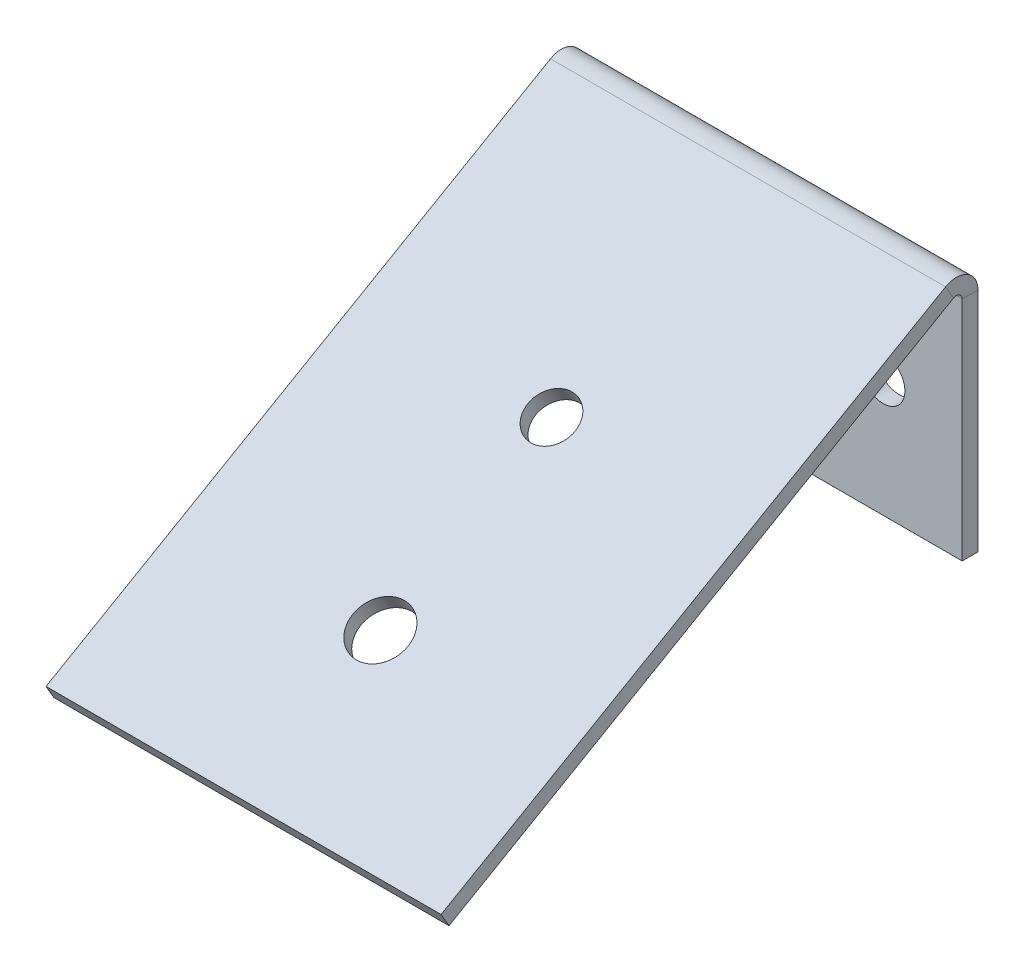
ISO-10303-21;
HEADER;
FILE_DESCRIPTION(('STEP AP214'),'2;1');
FILE_NAME('part.step','',(''),(''),'','','');
FILE_SCHEMA(('AUTOMOTIVE_DESIGN { 1 0 10303 214 1 1 1 1 }'));
ENDSEC;
DATA;
#1=APPLICATION_CONTEXT('core data for automotive mechanical design processes');
#2=APPLICATION_PROTOCOL_DEFINITION('international standard','automotive_design',2000,#1);
#3=PRODUCT_CONTEXT('',#1,'mechanical');
#4=PRODUCT('Part','Part','',(#3));
#5=PRODUCT_RELATED_PRODUCT_CATEGORY('part','',(#4));
#6=PRODUCT_DEFINITION_FORMATION('','',#4);
#7=PRODUCT_DEFINITION_CONTEXT('part definition',#1,'design');
#8=PRODUCT_DEFINITION('design','',#6,#7);
#9=PRODUCT_DEFINITION_SHAPE('','',#8);
#10=(LENGTH_UNIT() NAMED_UNIT(*) SI_UNIT(.MILLI.,.METRE.));
#11=(NAMED_UNIT(*) PLANE_ANGLE_UNIT() SI_UNIT($,.RADIAN.));
#12=(NAMED_UNIT(*) SI_UNIT($,.STERADIAN.) SOLID_ANGLE_UNIT());
#13=UNCERTAINTY_MEASURE_WITH_UNIT(LENGTH_MEASURE(1.E-05),#10,'distance_accuracy_value','');
#14=(GEOMETRIC_REPRESENTATION_CONTEXT(3) GLOBAL_UNCERTAINTY_ASSIGNED_CONTEXT((#13)) GLOBAL_UNIT_ASSIGNED_CONTEXT((#10,
#11,#12)) REPRESENTATION_CONTEXT('',''));
#15=CARTESIAN_POINT('',(0.,0.,0.));
#16=DIRECTION('',(0.,0.,1.));
#17=DIRECTION('',(1.,0.,0.));
#18=AXIS2_PLACEMENT_3D('',#15,#16,#17);
#19=CARTESIAN_POINT('',(50.,29.3620856875724,1.10490000000001));
#20=DIRECTION('',(1.,0.,0.));
#21=DIRECTION('',(0.,0.,-1.));
#22=AXIS2_PLACEMENT_3D('',#19,#20,#21);
#23=PLANE('',#22);
#24=DIRECTION('',(0.,0.866025403784435,0.500000000000006));
#25=VECTOR('',#24,1.);
#26=CARTESIAN_POINT('',(50.,29.3620856875724,1.10490000000001));
#27=LINE('',#26,#25);
#28=CARTESIAN_POINT('',(50.,29.3620856875724,1.10490000000001));
#29=VERTEX_POINT('',#28);
#30=CARTESIAN_POINT('',(50.,31.0941364951412,2.10490000000002));
#31=VERTEX_POINT('',#30);
#32=EDGE_CURVE('E11',#29,#31,#27,.T.);
#33=ORIENTED_EDGE('',*,*,#32,.F.);
#34=CARTESIAN_POINT('',(50.,28.7241713751448,0.736600000000001));
#35=DIRECTION('',(-1.,0.,0.));
#36=DIRECTION('',(0.,0.,1.));
#37=AXIS2_PLACEMENT_3D('',#34,#35,#36);
#38=CIRCLE('',#37,0.7366);
#39=CARTESIAN_POINT('',(50.,28.7241713751448,0.));
#40=VERTEX_POINT('',#39);
#41=EDGE_CURVE('E128',#29,#40,#38,.T.);
#42=ORIENTED_EDGE('',*,*,#41,.T.);
#43=DIRECTION('',(0.,0.,1.));
#44=VECTOR('',#43,1.);
#45=CARTESIAN_POINT('',(50.,28.7241713751448,-2.));
#46=LINE('',#45,#44);
#47=CARTESIAN_POINT('',(50.,28.7241713751448,-2.));
#48=VERTEX_POINT('',#47);
#49=EDGE_CURVE('E46',#48,#40,#46,.T.);
#50=ORIENTED_EDGE('',*,*,#49,.F.);
#51=CARTESIAN_POINT('',(50.,28.7241713751448,0.736600000000001));
#52=DIRECTION('',(1.,0.,0.));
#53=DIRECTION('',(0.,0.,-1.));
#54=AXIS2_PLACEMENT_3D('',#51,#52,#53);
#55=CIRCLE('',#54,2.7366);
#56=EDGE_CURVE('E135',#31,#48,#55,.F.);
#57=ORIENTED_EDGE('',*,*,#56,.F.);
#58=EDGE_LOOP('',(#33,#42,#50,#57));
#59=FACE_BOUND('',#58,.T.);
#60=ADVANCED_FACE('F38',(#59),#23,.T.);
#61=CARTESIAN_POINT('',(50.,28.7241713751448,-2.));
#62=DIRECTION('',(1.,0.,0.));
#63=DIRECTION('',(0.,0.,-1.));
#64=AXIS2_PLACEMENT_3D('',#61,#62,#63);
#65=PLANE('',#64);
#66=DIRECTION('',(0.,0.500000000000004,-0.866025403784436));
#67=VECTOR('',#66,1.);
#68=CARTESIAN_POINT('',(50.,30.,0.));
#69=LINE('',#68,#67);
#70=CARTESIAN_POINT('',(50.,-7.50000000000032,64.9519052838327));
#71=VERTEX_POINT('',#70);
#72=EDGE_CURVE('E123',#71,#29,#69,.T.);
#73=ORIENTED_EDGE('',*,*,#72,.T.);
#74=ORIENTED_EDGE('',*,*,#32,.T.);
#75=DIRECTION('',(0.,0.500000000000004,-0.866025403784436));
#76=VECTOR('',#75,1.);
#77=CARTESIAN_POINT('',(50.,31.7320508075689,1.00000000000001));
#78=LINE('',#77,#76);
#79=CARTESIAN_POINT('',(50.,-5.76794919243146,65.9519052838328));
#80=VERTEX_POINT('',#79);
#81=EDGE_CURVE('E133',#80,#31,#78,.T.);
#82=ORIENTED_EDGE('',*,*,#81,.F.);
#83=DIRECTION('',(0.,0.866025403784427,0.50000000000002));
#84=VECTOR('',#83,1.);
#85=CARTESIAN_POINT('',(50.,-7.50000000000032,64.9519052838327));
#86=LINE('',#85,#84);
#87=EDGE_CURVE('E114',#71,#80,#86,.T.);
#88=ORIENTED_EDGE('',*,*,#87,.F.);
#89=EDGE_LOOP('',(#73,#74,#82,#88));
#90=FACE_BOUND('',#89,.T.);
#91=ADVANCED_FACE('F131',(#90),#65,.T.);
#92=CARTESIAN_POINT('',(0.,28.7241713751448,0.));
#93=DIRECTION('',(-1.,0.,0.));
#94=DIRECTION('',(0.,0.,1.));
#95=AXIS2_PLACEMENT_3D('',#92,#93,#94);
#96=PLANE('',#95);
#97=DIRECTION('',(0.,0.,-1.));
#98=VECTOR('',#97,1.);
#99=CARTESIAN_POINT('',(0.,28.7241713751448,0.));
#100=LINE('',#99,#98);
#101=CARTESIAN_POINT('',(0.,28.7241713751448,0.));
#102=VERTEX_POINT('',#101);
#103=CARTESIAN_POINT('',(0.,28.7241713751448,-2.));
#104=VERTEX_POINT('',#103);
#105=EDGE_CURVE('E89',#102,#104,#100,.T.);
#106=ORIENTED_EDGE('',*,*,#105,.F.);
#107=CARTESIAN_POINT('',(0.,28.7241713751448,0.736600000000001));
#108=DIRECTION('',(-1.,0.,0.));
#109=DIRECTION('',(0.,0.,1.));
#110=AXIS2_PLACEMENT_3D('',#107,#108,#109);
#111=CIRCLE('',#110,0.7366);
#112=CARTESIAN_POINT('',(0.,29.3620856875724,1.10490000000001));
#113=VERTEX_POINT('',#112);
#114=EDGE_CURVE('E158',#113,#102,#111,.T.);
#115=ORIENTED_EDGE('',*,*,#114,.F.);
#116=DIRECTION('',(0.,-0.866025403784435,-0.500000000000006));
#117=VECTOR('',#116,1.);
#118=CARTESIAN_POINT('',(0.,31.0941364951412,2.10490000000002));
#119=LINE('',#118,#117);
#120=CARTESIAN_POINT('',(0.,31.0941364951412,2.10490000000002));
#121=VERTEX_POINT('',#120);
#122=EDGE_CURVE('E82',#121,#113,#119,.T.);
#123=ORIENTED_EDGE('',*,*,#122,.F.);
#124=CARTESIAN_POINT('',(0.,28.7241713751448,0.736600000000001));
#125=DIRECTION('',(1.,0.,0.));
#126=DIRECTION('',(0.,0.,-1.));
#127=AXIS2_PLACEMENT_3D('',#124,#125,#126);
#128=CIRCLE('',#127,2.7366);
#129=EDGE_CURVE('E151',#121,#104,#128,.F.);
#130=ORIENTED_EDGE('',*,*,#129,.T.);
#131=EDGE_LOOP('',(#106,#115,#123,#130));
#132=FACE_BOUND('',#131,.T.);
#133=ADVANCED_FACE('F190',(#132),#96,.T.);
#134=CARTESIAN_POINT('',(0.,31.0941364951412,2.10490000000002));
#135=DIRECTION('',(-1.,0.,0.));
#136=DIRECTION('',(0.,0.,1.));
#137=AXIS2_PLACEMENT_3D('',#134,#135,#136);
#138=PLANE('',#137);
#139=DIRECTION('',(0.,-1.,0.));
#140=VECTOR('',#139,1.);
#141=CARTESIAN_POINT('',(0.,0.,0.));
#142=LINE('',#141,#140);
#143=CARTESIAN_POINT('',(0.,0.,0.));
#144=VERTEX_POINT('',#143);
#145=EDGE_CURVE('E141',#102,#144,#142,.T.);
#146=ORIENTED_EDGE('',*,*,#145,.F.);
#147=ORIENTED_EDGE('',*,*,#105,.T.);
#148=DIRECTION('',(0.,1.,0.));
#149=VECTOR('',#148,1.);
#150=CARTESIAN_POINT('',(0.,0.,-2.));
#151=LINE('',#150,#149);
#152=CARTESIAN_POINT('',(0.,0.,-2.));
#153=VERTEX_POINT('',#152);
#154=EDGE_CURVE('E148',#104,#153,#151,.F.);
#155=ORIENTED_EDGE('',*,*,#154,.T.);
#156=DIRECTION('',(0.,0.,1.));
#157=VECTOR('',#156,1.);
#158=CARTESIAN_POINT('',(0.,0.,-2.));
#159=LINE('',#158,#157);
#160=EDGE_CURVE('E144',#153,#144,#159,.T.);
#161=ORIENTED_EDGE('',*,*,#160,.T.);
#162=EDGE_LOOP('',(#146,#147,#155,#161));
#163=FACE_BOUND('',#162,.T.);
#164=ADVANCED_FACE('F177',(#163),#138,.T.);
#165=CARTESIAN_POINT('',(50.,0.,0.));
#166=DIRECTION('',(0.,0.,-1.));
#167=DIRECTION('',(-1.,0.,0.));
#168=AXIS2_PLACEMENT_3D('',#165,#166,#167);
#169=PLANE('',#168);
#170=CARTESIAN_POINT('',(10.,15.,0.));
#171=DIRECTION('',(0.,0.,-1.));
#172=DIRECTION('',(-1.,0.,0.));
#173=AXIS2_PLACEMENT_3D('',#170,#171,#172);
#174=CIRCLE('',#173,2.75);
#175=CARTESIAN_POINT('',(7.25,15.,0.));
#176=VERTEX_POINT('',#175);
#177=EDGE_CURVE('E219',#176,#176,#174,.T.);
#178=ORIENTED_EDGE('',*,*,#177,.T.);
#179=EDGE_LOOP('',(#178));
#180=FACE_BOUND('',#179,.T.);
#181=CARTESIAN_POINT('',(40.,15.,0.));
#182=DIRECTION('',(0.,0.,-1.));
#183=DIRECTION('',(-1.,0.,0.));
#184=AXIS2_PLACEMENT_3D('',#181,#182,#183);
#185=CIRCLE('',#184,2.75);
#186=CARTESIAN_POINT('',(37.25,15.,0.));
#187=VERTEX_POINT('',#186);
#188=EDGE_CURVE('E213',#187,#187,#185,.T.);
#189=ORIENTED_EDGE('',*,*,#188,.T.);
#190=EDGE_LOOP('',(#189));
#191=FACE_BOUND('',#190,.T.);
#192=ORIENTED_EDGE('',*,*,#145,.T.);
#193=DIRECTION('',(-1.,0.,0.));
#194=VECTOR('',#193,1.);
#195=CARTESIAN_POINT('',(50.,0.,0.));
#196=LINE('',#195,#194);
#197=CARTESIAN_POINT('',(50.,0.,0.));
#198=VERTEX_POINT('',#197);
#199=EDGE_CURVE('E172',#198,#144,#196,.T.);
#200=ORIENTED_EDGE('',*,*,#199,.F.);
#201=DIRECTION('',(0.,-1.,0.));
#202=VECTOR('',#201,1.);
#203=CARTESIAN_POINT('',(50.,0.,0.));
#204=LINE('',#203,#202);
#205=EDGE_CURVE('E95',#40,#198,#204,.T.);
#206=ORIENTED_EDGE('',*,*,#205,.F.);
#207=DIRECTION('',(-1.,0.,0.));
#208=VECTOR('',#207,1.);
#209=CARTESIAN_POINT('',(50.,28.7241713751448,0.));
#210=LINE('',#209,#208);
#211=EDGE_CURVE('E140',#40,#102,#210,.T.);
#212=ORIENTED_EDGE('',*,*,#211,.T.);
#213=EDGE_LOOP('',(#192,#200,#206,#212));
#214=FACE_BOUND('',#213,.T.);
#215=ADVANCED_FACE('F260',(#180,#191,#214),#169,.F.);
#216=CARTESIAN_POINT('',(50.,0.,-2.));
#217=DIRECTION('',(0.,-1.,0.));
#218=DIRECTION('',(0.,0.,-1.));
#219=AXIS2_PLACEMENT_3D('',#216,#217,#218);
#220=PLANE('',#219);
#221=ORIENTED_EDGE('',*,*,#160,.F.);
#222=DIRECTION('',(-1.,0.,0.));
#223=VECTOR('',#222,1.);
#224=CARTESIAN_POINT('',(50.,0.,-2.));
#225=LINE('',#224,#223);
#226=CARTESIAN_POINT('',(50.,0.,-2.));
#227=VERTEX_POINT('',#226);
#228=EDGE_CURVE('E170',#227,#153,#225,.T.);
#229=ORIENTED_EDGE('',*,*,#228,.F.);
#230=DIRECTION('',(0.,0.,1.));
#231=VECTOR('',#230,1.);
#232=CARTESIAN_POINT('',(50.,0.,-2.));
#233=LINE('',#232,#231);
#234=EDGE_CURVE('E196',#227,#198,#233,.T.);
#235=ORIENTED_EDGE('',*,*,#234,.T.);
#236=ORIENTED_EDGE('',*,*,#199,.T.);
#237=EDGE_LOOP('',(#221,#229,#235,#236));
#238=FACE_BOUND('',#237,.T.);
#239=ADVANCED_FACE('F230',(#238),#220,.T.);
#240=CARTESIAN_POINT('',(50.,0.,-2.));
#241=DIRECTION('',(0.,0.,-1.));
#242=DIRECTION('',(-1.,0.,0.));
#243=AXIS2_PLACEMENT_3D('',#240,#241,#242);
#244=PLANE('',#243);
#245=CARTESIAN_POINT('',(10.,15.,-2.));
#246=DIRECTION('',(0.,0.,-1.));
#247=DIRECTION('',(-1.,0.,0.));
#248=AXIS2_PLACEMENT_3D('',#245,#246,#247);
#249=CIRCLE('',#248,2.74999999999999);
#250=CARTESIAN_POINT('',(7.25000000000001,15.,-2.));
#251=VERTEX_POINT('',#250);
#252=EDGE_CURVE('E222',#251,#251,#249,.T.);
#253=ORIENTED_EDGE('',*,*,#252,.F.);
#254=EDGE_LOOP('',(#253));
#255=FACE_BOUND('',#254,.T.);
#256=CARTESIAN_POINT('',(40.,15.,-2.));
#257=DIRECTION('',(0.,0.,-1.));
#258=DIRECTION('',(-1.,0.,0.));
#259=AXIS2_PLACEMENT_3D('',#256,#257,#258);
#260=CIRCLE('',#259,2.75);
#261=CARTESIAN_POINT('',(37.25,15.,-2.));
#262=VERTEX_POINT('',#261);
#263=EDGE_CURVE('E216',#262,#262,#260,.T.);
#264=ORIENTED_EDGE('',*,*,#263,.F.);
#265=EDGE_LOOP('',(#264));
#266=FACE_BOUND('',#265,.T.);
#267=ORIENTED_EDGE('',*,*,#154,.F.);
#268=DIRECTION('',(-1.,0.,0.));
#269=VECTOR('',#268,1.);
#270=CARTESIAN_POINT('',(50.,28.7241713751448,-2.));
#271=LINE('',#270,#269);
#272=EDGE_CURVE('E167',#48,#104,#271,.T.);
#273=ORIENTED_EDGE('',*,*,#272,.F.);
#274=DIRECTION('',(0.,1.,0.));
#275=VECTOR('',#274,1.);
#276=CARTESIAN_POINT('',(50.,0.,-2.));
#277=LINE('',#276,#275);
#278=EDGE_CURVE('E195',#48,#227,#277,.F.);
#279=ORIENTED_EDGE('',*,*,#278,.T.);
#280=ORIENTED_EDGE('',*,*,#228,.T.);
#281=EDGE_LOOP('',(#267,#273,#279,#280));
#282=FACE_BOUND('',#281,.T.);
#283=ADVANCED_FACE('F188',(#255,#266,#282),#244,.T.);
#284=CARTESIAN_POINT('',(50.,28.7241713751448,0.736600000000001));
#285=DIRECTION('',(-1.,0.,0.));
#286=DIRECTION('',(0.,0.,1.));
#287=AXIS2_PLACEMENT_3D('',#284,#285,#286);
#288=CYLINDRICAL_SURFACE('',#287,2.7366);
#289=ORIENTED_EDGE('',*,*,#129,.F.);
#290=DIRECTION('',(-1.,0.,0.));
#291=VECTOR('',#290,1.);
#292=CARTESIAN_POINT('',(50.,31.0941364951412,2.10490000000002));
#293=LINE('',#292,#291);
#294=EDGE_CURVE('E164',#31,#121,#293,.T.);
#295=ORIENTED_EDGE('',*,*,#294,.F.);
#296=ORIENTED_EDGE('',*,*,#56,.T.);
#297=ORIENTED_EDGE('',*,*,#272,.T.);
#298=EDGE_LOOP('',(#289,#295,#296,#297));
#299=FACE_BOUND('',#298,.T.);
#300=ADVANCED_FACE('F183',(#299),#288,.T.);
#301=CARTESIAN_POINT('',(50.,31.7320508075689,1.00000000000001));
#302=DIRECTION('',(0.,0.866025403784436,0.500000000000004));
#303=DIRECTION('',(0.,-0.500000000000004,0.866025403784436));
#304=AXIS2_PLACEMENT_3D('',#301,#302,#303);
#305=PLANE('',#304);
#306=CARTESIAN_POINT('',(25.,4.23205080756861,48.6313972081441));
#307=DIRECTION('',(0.,0.866025403784436,0.500000000000005));
#308=DIRECTION('',(0.,-0.500000000000005,0.866025403784436));
#309=AXIS2_PLACEMENT_3D('',#306,#307,#308);
#310=CIRCLE('',#309,3.5);
#311=CARTESIAN_POINT('',(25.,2.48205080756859,51.6624861213896));
#312=VERTEX_POINT('',#311);
#313=EDGE_CURVE('E210',#312,#312,#310,.T.);
#314=ORIENTED_EDGE('',*,*,#313,.F.);
#315=EDGE_LOOP('',(#314));
#316=FACE_BOUND('',#315,.T.);
#317=CARTESIAN_POINT('',(25.,16.7320508075687,26.9807621135331));
#318=DIRECTION('',(0.,0.866025403784436,0.500000000000005));
#319=DIRECTION('',(0.,-0.500000000000005,0.866025403784436));
#320=AXIS2_PLACEMENT_3D('',#317,#318,#319);
#321=CIRCLE('',#320,3.00000000000001);
#322=CARTESIAN_POINT('',(25.,15.2320508075687,29.5788383248865));
#323=VERTEX_POINT('',#322);
#324=EDGE_CURVE('E204',#323,#323,#321,.T.);
#325=ORIENTED_EDGE('',*,*,#324,.F.);
#326=EDGE_LOOP('',(#325));
#327=FACE_BOUND('',#326,.T.);
#328=DIRECTION('',(0.,0.500000000000004,-0.866025403784436));
#329=VECTOR('',#328,1.);
#330=CARTESIAN_POINT('',(0.,31.7320508075689,1.00000000000001));
#331=LINE('',#330,#329);
#332=CARTESIAN_POINT('',(0.,-5.76794919243146,65.9519052838328));
#333=VERTEX_POINT('',#332);
#334=EDGE_CURVE('E153',#333,#121,#331,.T.);
#335=ORIENTED_EDGE('',*,*,#334,.F.);
#336=DIRECTION('',(-1.,0.,0.));
#337=VECTOR('',#336,1.);
#338=CARTESIAN_POINT('',(50.,-5.76794919243146,65.9519052838328));
#339=LINE('',#338,#337);
#340=EDGE_CURVE('E118',#80,#333,#339,.T.);
#341=ORIENTED_EDGE('',*,*,#340,.F.);
#342=ORIENTED_EDGE('',*,*,#81,.T.);
#343=ORIENTED_EDGE('',*,*,#294,.T.);
#344=EDGE_LOOP('',(#335,#341,#342,#343));
#345=FACE_BOUND('',#344,.T.);
#346=ADVANCED_FACE('F193',(#316,#327,#345),#305,.T.);
#347=CARTESIAN_POINT('',(50.,-7.50000000000032,64.9519052838327));
#348=DIRECTION('',(0.,-0.50000000000002,0.866025403784427));
#349=DIRECTION('',(0.,-0.866025403784427,-0.50000000000002));
#350=AXIS2_PLACEMENT_3D('',#347,#348,#349);
#351=PLANE('',#350);
#352=DIRECTION('',(0.,0.866025403784427,0.50000000000002));
#353=VECTOR('',#352,1.);
#354=CARTESIAN_POINT('',(0.,-7.50000000000032,64.9519052838327));
#355=LINE('',#354,#353);
#356=CARTESIAN_POINT('',(0.,-7.50000000000032,64.9519052838327));
#357=VERTEX_POINT('',#356);
#358=EDGE_CURVE('E116',#357,#333,#355,.T.);
#359=ORIENTED_EDGE('',*,*,#358,.F.);
#360=DIRECTION('',(-1.,0.,0.));
#361=VECTOR('',#360,1.);
#362=CARTESIAN_POINT('',(50.,-7.50000000000032,64.9519052838327));
#363=LINE('',#362,#361);
#364=EDGE_CURVE('E110',#71,#357,#363,.T.);
#365=ORIENTED_EDGE('',*,*,#364,.F.);
#366=ORIENTED_EDGE('',*,*,#87,.T.);
#367=ORIENTED_EDGE('',*,*,#340,.T.);
#368=EDGE_LOOP('',(#359,#365,#366,#367));
#369=FACE_BOUND('',#368,.T.);
#370=ADVANCED_FACE('F112',(#369),#351,.T.);
#371=CARTESIAN_POINT('',(50.,30.,0.));
#372=DIRECTION('',(0.,0.866025403784436,0.500000000000004));
#373=DIRECTION('',(0.,-0.500000000000004,0.866025403784436));
#374=AXIS2_PLACEMENT_3D('',#371,#372,#373);
#375=PLANE('',#374);
#376=CARTESIAN_POINT('',(25.,2.49999999999973,47.631397208144));
#377=DIRECTION('',(0.,0.866025403784436,0.500000000000004));
#378=DIRECTION('',(0.,-0.500000000000004,0.866025403784436));
#379=AXIS2_PLACEMENT_3D('',#376,#377,#378);
#380=CIRCLE('',#379,3.5);
#381=CARTESIAN_POINT('',(25.,0.749999999999713,50.6624861213896));
#382=VERTEX_POINT('',#381);
#383=EDGE_CURVE('E207',#382,#382,#380,.F.);
#384=ORIENTED_EDGE('',*,*,#383,.F.);
#385=EDGE_LOOP('',(#384));
#386=FACE_BOUND('',#385,.T.);
#387=CARTESIAN_POINT('',(25.,14.9999999999998,25.9807621135331));
#388=DIRECTION('',(0.,0.866025403784436,0.500000000000004));
#389=DIRECTION('',(0.,-0.500000000000004,0.866025403784436));
#390=AXIS2_PLACEMENT_3D('',#387,#388,#389);
#391=CIRCLE('',#390,3.00000000000001);
#392=CARTESIAN_POINT('',(25.,13.4999999999998,28.5788383248864));
#393=VERTEX_POINT('',#392);
#394=EDGE_CURVE('E145',#393,#393,#391,.F.);
#395=ORIENTED_EDGE('',*,*,#394,.F.);
#396=EDGE_LOOP('',(#395));
#397=FACE_BOUND('',#396,.T.);
#398=DIRECTION('',(0.,0.500000000000004,-0.866025403784436));
#399=VECTOR('',#398,1.);
#400=CARTESIAN_POINT('',(0.,30.,0.));
#401=LINE('',#400,#399);
#402=EDGE_CURVE('E156',#357,#113,#401,.T.);
#403=ORIENTED_EDGE('',*,*,#402,.T.);
#404=DIRECTION('',(-1.,0.,0.));
#405=VECTOR('',#404,1.);
#406=CARTESIAN_POINT('',(50.,29.3620856875724,1.10490000000001));
#407=LINE('',#406,#405);
#408=EDGE_CURVE('E119',#29,#113,#407,.T.);
#409=ORIENTED_EDGE('',*,*,#408,.F.);
#410=ORIENTED_EDGE('',*,*,#72,.F.);
#411=ORIENTED_EDGE('',*,*,#364,.T.);
#412=EDGE_LOOP('',(#403,#409,#410,#411));
#413=FACE_BOUND('',#412,.T.);
#414=ADVANCED_FACE('F124',(#386,#397,#413),#375,.F.);
#415=CARTESIAN_POINT('',(50.,28.7241713751448,0.736600000000001));
#416=DIRECTION('',(-1.,0.,0.));
#417=DIRECTION('',(0.,0.,1.));
#418=AXIS2_PLACEMENT_3D('',#415,#416,#417);
#419=CYLINDRICAL_SURFACE('',#418,0.7366);
#420=ORIENTED_EDGE('',*,*,#114,.T.);
#421=ORIENTED_EDGE('',*,*,#211,.F.);
#422=ORIENTED_EDGE('',*,*,#41,.F.);
#423=ORIENTED_EDGE('',*,*,#408,.T.);
#424=EDGE_LOOP('',(#420,#421,#422,#423));
#425=FACE_BOUND('',#424,.T.);
#426=ADVANCED_FACE('F276',(#425),#419,.F.);
#427=CARTESIAN_POINT('',(50.,28.7241713751448,0.736600000000001));
#428=DIRECTION('',(1.,0.,0.));
#429=DIRECTION('',(0.,0.,-1.));
#430=AXIS2_PLACEMENT_3D('',#427,#428,#429);
#431=PLANE('',#430);
#432=ORIENTED_EDGE('',*,*,#205,.T.);
#433=ORIENTED_EDGE('',*,*,#234,.F.);
#434=ORIENTED_EDGE('',*,*,#278,.F.);
#435=ORIENTED_EDGE('',*,*,#49,.T.);
#436=EDGE_LOOP('',(#432,#433,#434,#435));
#437=FACE_BOUND('',#436,.T.);
#438=ADVANCED_FACE('F280',(#437),#431,.T.);
#439=CARTESIAN_POINT('',(0.,28.7241713751448,0.736600000000001));
#440=DIRECTION('',(1.,0.,0.));
#441=DIRECTION('',(0.,0.,-1.));
#442=AXIS2_PLACEMENT_3D('',#439,#440,#441);
#443=PLANE('',#442);
#444=ORIENTED_EDGE('',*,*,#334,.T.);
#445=ORIENTED_EDGE('',*,*,#122,.T.);
#446=ORIENTED_EDGE('',*,*,#402,.F.);
#447=ORIENTED_EDGE('',*,*,#358,.T.);
#448=EDGE_LOOP('',(#444,#445,#446,#447));
#449=FACE_BOUND('',#448,.T.);
#450=ADVANCED_FACE('F282',(#449),#443,.F.);
#451=CARTESIAN_POINT('',(25.,-13.9922084164866,9.24210277987277));
#452=DIRECTION('',(0.,0.866025403784436,0.500000000000004));
#453=DIRECTION('',(0.,-0.500000000000004,0.866025403784436));
#454=AXIS2_PLACEMENT_3D('',#451,#452,#453);
#455=CYLINDRICAL_SURFACE('',#454,3.00000000000001);
#456=ORIENTED_EDGE('',*,*,#324,.T.);
#457=EDGE_LOOP('',(#456));
#458=FACE_BOUND('',#457,.T.);
#459=ORIENTED_EDGE('',*,*,#394,.T.);
#460=EDGE_LOOP('',(#459));
#461=FACE_BOUND('',#460,.T.);
#462=ADVANCED_FACE('F245',(#458,#461),#455,.F.);
#463=CARTESIAN_POINT('',(25.,-26.4922084164867,30.8927378744837));
#464=DIRECTION('',(0.,0.866025403784436,0.500000000000004));
#465=DIRECTION('',(0.,-0.500000000000004,0.866025403784436));
#466=AXIS2_PLACEMENT_3D('',#463,#464,#465);
#467=CYLINDRICAL_SURFACE('',#466,3.5);
#468=ORIENTED_EDGE('',*,*,#313,.T.);
#469=EDGE_LOOP('',(#468));
#470=FACE_BOUND('',#469,.T.);
#471=ORIENTED_EDGE('',*,*,#383,.T.);
#472=EDGE_LOOP('',(#471));
#473=FACE_BOUND('',#472,.T.);
#474=ADVANCED_FACE('F236',(#470,#473),#467,.F.);
#475=CARTESIAN_POINT('',(40.,15.,-2.));
#476=DIRECTION('',(0.,0.,-1.));
#477=DIRECTION('',(-1.,0.,0.));
#478=AXIS2_PLACEMENT_3D('',#475,#476,#477);
#479=CYLINDRICAL_SURFACE('',#478,2.75);
#480=ORIENTED_EDGE('',*,*,#188,.F.);
#481=EDGE_LOOP('',(#480));
#482=FACE_BOUND('',#481,.T.);
#483=ORIENTED_EDGE('',*,*,#263,.T.);
#484=EDGE_LOOP('',(#483));
#485=FACE_BOUND('',#484,.T.);
#486=ADVANCED_FACE('F234',(#482,#485),#479,.F.);
#487=CARTESIAN_POINT('',(10.,15.,-2.));
#488=DIRECTION('',(0.,0.,-1.));
#489=DIRECTION('',(-1.,0.,0.));
#490=AXIS2_PLACEMENT_3D('',#487,#488,#489);
#491=CYLINDRICAL_SURFACE('',#490,2.75);
#492=ORIENTED_EDGE('',*,*,#177,.F.);
#493=EDGE_LOOP('',(#492));
#494=FACE_BOUND('',#493,.T.);
#495=ORIENTED_EDGE('',*,*,#252,.T.);
#496=EDGE_LOOP('',(#495));
#497=FACE_BOUND('',#496,.T.);
#498=ADVANCED_FACE('F226',(#494,#497),#491,.F.);
#499=CLOSED_SHELL('',(#60,#91,#133,#164,#215,#239,#283,#300,#346,#370,#414,#426,#438,#450,#462,
#474,#486,#498));
#500=MANIFOLD_SOLID_BREP('B2',#499);
#501=ADVANCED_BREP_SHAPE_REPRESENTATION('',(#18,#500),#14);
#502=SHAPE_DEFINITION_REPRESENTATION(#9,#501);
ENDSEC;
END-ISO-10303-21;
